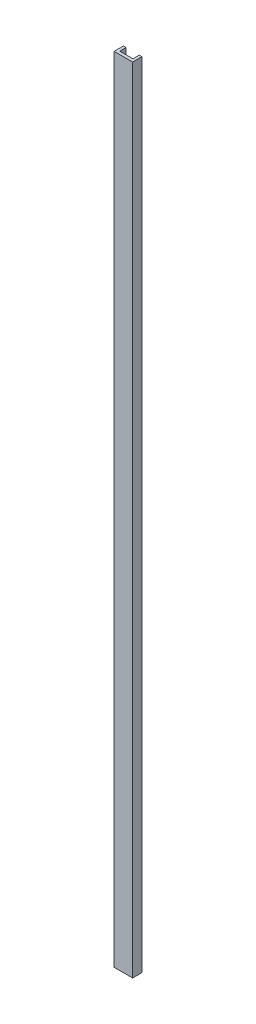
ISO-10303-21;
HEADER;
FILE_DESCRIPTION(('STEP AP214'),'2;1');
FILE_NAME('part.step','',(''),(''),'','','');
FILE_SCHEMA(('AUTOMOTIVE_DESIGN { 1 0 10303 214 1 1 1 1 }'));
ENDSEC;
DATA;
#1=APPLICATION_CONTEXT('core data for automotive mechanical design processes');
#2=APPLICATION_PROTOCOL_DEFINITION('international standard','automotive_design',2000,#1);
#3=PRODUCT_CONTEXT('',#1,'mechanical');
#4=PRODUCT('Part','Part','',(#3));
#5=PRODUCT_RELATED_PRODUCT_CATEGORY('part','',(#4));
#6=PRODUCT_DEFINITION_FORMATION('','',#4);
#7=PRODUCT_DEFINITION_CONTEXT('part definition',#1,'design');
#8=PRODUCT_DEFINITION('design','',#6,#7);
#9=PRODUCT_DEFINITION_SHAPE('','',#8);
#10=(LENGTH_UNIT() NAMED_UNIT(*) SI_UNIT(.MILLI.,.METRE.));
#11=(NAMED_UNIT(*) PLANE_ANGLE_UNIT() SI_UNIT($,.RADIAN.));
#12=(NAMED_UNIT(*) SI_UNIT($,.STERADIAN.) SOLID_ANGLE_UNIT());
#13=UNCERTAINTY_MEASURE_WITH_UNIT(LENGTH_MEASURE(1.E-05),#10,'distance_accuracy_value','');
#14=(GEOMETRIC_REPRESENTATION_CONTEXT(3) GLOBAL_UNCERTAINTY_ASSIGNED_CONTEXT((#13)) GLOBAL_UNIT_ASSIGNED_CONTEXT((#10,
#11,#12)) REPRESENTATION_CONTEXT('',''));
#15=CARTESIAN_POINT('',(0.,0.,0.));
#16=DIRECTION('',(0.,0.,1.));
#17=DIRECTION('',(1.,0.,0.));
#18=AXIS2_PLACEMENT_3D('',#15,#16,#17);
#19=CARTESIAN_POINT('',(-10.,1200.,-7.));
#20=DIRECTION('',(0.,0.,1.));
#21=DIRECTION('',(1.,0.,0.));
#22=AXIS2_PLACEMENT_3D('',#19,#20,#21);
#23=PLANE('',#22);
#24=DIRECTION('',(-1.,0.,0.));
#25=VECTOR('',#24,1.);
#26=CARTESIAN_POINT('',(-10.,0.,-7.));
#27=LINE('',#26,#25);
#28=CARTESIAN_POINT('',(-10.,0.,-7.));
#29=VERTEX_POINT('',#28);
#30=CARTESIAN_POINT('',(-14.,0.,-7.));
#31=VERTEX_POINT('',#30);
#32=EDGE_CURVE('E144',#29,#31,#27,.T.);
#33=ORIENTED_EDGE('',*,*,#32,.T.);
#34=DIRECTION('',(0.,-1.,0.));
#35=VECTOR('',#34,1.);
#36=CARTESIAN_POINT('',(-14.,1200.,-7.));
#37=LINE('',#36,#35);
#38=CARTESIAN_POINT('',(-14.,1200.,-7.));
#39=VERTEX_POINT('',#38);
#40=EDGE_CURVE('E11',#39,#31,#37,.T.);
#41=ORIENTED_EDGE('',*,*,#40,.F.);
#42=DIRECTION('',(-1.,0.,0.));
#43=VECTOR('',#42,1.);
#44=CARTESIAN_POINT('',(-10.,1200.,-7.));
#45=LINE('',#44,#43);
#46=CARTESIAN_POINT('',(-10.,1200.,-7.));
#47=VERTEX_POINT('',#46);
#48=EDGE_CURVE('E166',#47,#39,#45,.T.);
#49=ORIENTED_EDGE('',*,*,#48,.F.);
#50=DIRECTION('',(0.,-1.,0.));
#51=VECTOR('',#50,1.);
#52=CARTESIAN_POINT('',(-10.,1200.,-7.));
#53=LINE('',#52,#51);
#54=EDGE_CURVE('E140',#47,#29,#53,.T.);
#55=ORIENTED_EDGE('',*,*,#54,.T.);
#56=EDGE_LOOP('',(#33,#41,#49,#55));
#57=FACE_BOUND('',#56,.T.);
#58=ADVANCED_FACE('F43',(#57),#23,.F.);
#59=CARTESIAN_POINT('',(-14.,1200.,7.));
#60=DIRECTION('',(1.,0.,0.));
#61=DIRECTION('',(0.,0.,-1.));
#62=AXIS2_PLACEMENT_3D('',#59,#60,#61);
#63=PLANE('',#62);
#64=DIRECTION('',(0.,0.,1.));
#65=VECTOR('',#64,1.);
#66=CARTESIAN_POINT('',(-14.,0.,7.));
#67=LINE('',#66,#65);
#68=CARTESIAN_POINT('',(-14.,0.,7.));
#69=VERTEX_POINT('',#68);
#70=EDGE_CURVE('E148',#31,#69,#67,.T.);
#71=ORIENTED_EDGE('',*,*,#70,.T.);
#72=DIRECTION('',(0.,-1.,0.));
#73=VECTOR('',#72,1.);
#74=CARTESIAN_POINT('',(-14.,1200.,7.));
#75=LINE('',#74,#73);
#76=CARTESIAN_POINT('',(-14.,1200.,7.));
#77=VERTEX_POINT('',#76);
#78=EDGE_CURVE('E52',#77,#69,#75,.T.);
#79=ORIENTED_EDGE('',*,*,#78,.F.);
#80=DIRECTION('',(0.,0.,1.));
#81=VECTOR('',#80,1.);
#82=CARTESIAN_POINT('',(-14.,1200.,7.));
#83=LINE('',#82,#81);
#84=EDGE_CURVE('E103',#39,#77,#83,.T.);
#85=ORIENTED_EDGE('',*,*,#84,.F.);
#86=ORIENTED_EDGE('',*,*,#40,.T.);
#87=EDGE_LOOP('',(#71,#79,#85,#86));
#88=FACE_BOUND('',#87,.T.);
#89=ADVANCED_FACE('F212',(#88),#63,.F.);
#90=CARTESIAN_POINT('',(14.,1200.,7.));
#91=DIRECTION('',(0.,0.,-1.));
#92=DIRECTION('',(-1.,0.,0.));
#93=AXIS2_PLACEMENT_3D('',#90,#91,#92);
#94=PLANE('',#93);
#95=DIRECTION('',(1.,0.,0.));
#96=VECTOR('',#95,1.);
#97=CARTESIAN_POINT('',(14.,0.,7.));
#98=LINE('',#97,#96);
#99=CARTESIAN_POINT('',(14.,0.,7.));
#100=VERTEX_POINT('',#99);
#101=EDGE_CURVE('E151',#69,#100,#98,.T.);
#102=ORIENTED_EDGE('',*,*,#101,.T.);
#103=DIRECTION('',(0.,-1.,0.));
#104=VECTOR('',#103,1.);
#105=CARTESIAN_POINT('',(14.,1200.,7.));
#106=LINE('',#105,#104);
#107=CARTESIAN_POINT('',(14.,1200.,7.));
#108=VERTEX_POINT('',#107);
#109=EDGE_CURVE('E177',#108,#100,#106,.T.);
#110=ORIENTED_EDGE('',*,*,#109,.F.);
#111=DIRECTION('',(1.,0.,0.));
#112=VECTOR('',#111,1.);
#113=CARTESIAN_POINT('',(14.,1200.,7.));
#114=LINE('',#113,#112);
#115=EDGE_CURVE('E187',#77,#108,#114,.T.);
#116=ORIENTED_EDGE('',*,*,#115,.F.);
#117=ORIENTED_EDGE('',*,*,#78,.T.);
#118=EDGE_LOOP('',(#102,#110,#116,#117));
#119=FACE_BOUND('',#118,.T.);
#120=ADVANCED_FACE('F185',(#119),#94,.F.);
#121=CARTESIAN_POINT('',(14.,1200.,7.));
#122=DIRECTION('',(-1.,0.,0.));
#123=DIRECTION('',(0.,0.,1.));
#124=AXIS2_PLACEMENT_3D('',#121,#122,#123);
#125=PLANE('',#124);
#126=DIRECTION('',(0.,0.,-1.));
#127=VECTOR('',#126,1.);
#128=CARTESIAN_POINT('',(14.,0.,7.));
#129=LINE('',#128,#127);
#130=CARTESIAN_POINT('',(14.,0.,-7.));
#131=VERTEX_POINT('',#130);
#132=EDGE_CURVE('E154',#100,#131,#129,.T.);
#133=ORIENTED_EDGE('',*,*,#132,.T.);
#134=DIRECTION('',(0.,-1.,0.));
#135=VECTOR('',#134,1.);
#136=CARTESIAN_POINT('',(14.,1200.,-7.));
#137=LINE('',#136,#135);
#138=CARTESIAN_POINT('',(14.,1200.,-7.));
#139=VERTEX_POINT('',#138);
#140=EDGE_CURVE('E173',#139,#131,#137,.T.);
#141=ORIENTED_EDGE('',*,*,#140,.F.);
#142=DIRECTION('',(0.,0.,-1.));
#143=VECTOR('',#142,1.);
#144=CARTESIAN_POINT('',(14.,1200.,7.));
#145=LINE('',#144,#143);
#146=EDGE_CURVE('E200',#108,#139,#145,.T.);
#147=ORIENTED_EDGE('',*,*,#146,.F.);
#148=ORIENTED_EDGE('',*,*,#109,.T.);
#149=EDGE_LOOP('',(#133,#141,#147,#148));
#150=FACE_BOUND('',#149,.T.);
#151=ADVANCED_FACE('F195',(#150),#125,.F.);
#152=CARTESIAN_POINT('',(14.,1200.,-7.));
#153=DIRECTION('',(0.,0.,1.));
#154=DIRECTION('',(1.,0.,0.));
#155=AXIS2_PLACEMENT_3D('',#152,#153,#154);
#156=PLANE('',#155);
#157=DIRECTION('',(-1.,0.,0.));
#158=VECTOR('',#157,1.);
#159=CARTESIAN_POINT('',(14.,0.,-7.));
#160=LINE('',#159,#158);
#161=CARTESIAN_POINT('',(10.,0.,-7.));
#162=VERTEX_POINT('',#161);
#163=EDGE_CURVE('E157',#131,#162,#160,.T.);
#164=ORIENTED_EDGE('',*,*,#163,.T.);
#165=DIRECTION('',(0.,-1.,0.));
#166=VECTOR('',#165,1.);
#167=CARTESIAN_POINT('',(10.,1200.,-7.));
#168=LINE('',#167,#166);
#169=CARTESIAN_POINT('',(10.,1200.,-7.));
#170=VERTEX_POINT('',#169);
#171=EDGE_CURVE('E133',#170,#162,#168,.T.);
#172=ORIENTED_EDGE('',*,*,#171,.F.);
#173=DIRECTION('',(-1.,0.,0.));
#174=VECTOR('',#173,1.);
#175=CARTESIAN_POINT('',(14.,1200.,-7.));
#176=LINE('',#175,#174);
#177=EDGE_CURVE('E122',#139,#170,#176,.T.);
#178=ORIENTED_EDGE('',*,*,#177,.F.);
#179=ORIENTED_EDGE('',*,*,#140,.T.);
#180=EDGE_LOOP('',(#164,#172,#178,#179));
#181=FACE_BOUND('',#180,.T.);
#182=ADVANCED_FACE('F198',(#181),#156,.F.);
#183=CARTESIAN_POINT('',(10.,1200.,2.5));
#184=DIRECTION('',(1.,0.,0.));
#185=DIRECTION('',(0.,0.,-1.));
#186=AXIS2_PLACEMENT_3D('',#183,#184,#185);
#187=PLANE('',#186);
#188=DIRECTION('',(0.,0.,1.));
#189=VECTOR('',#188,1.);
#190=CARTESIAN_POINT('',(10.,0.,2.5));
#191=LINE('',#190,#189);
#192=CARTESIAN_POINT('',(10.,0.,2.5));
#193=VERTEX_POINT('',#192);
#194=EDGE_CURVE('E131',#162,#193,#191,.T.);
#195=ORIENTED_EDGE('',*,*,#194,.T.);
#196=DIRECTION('',(0.,-1.,0.));
#197=VECTOR('',#196,1.);
#198=CARTESIAN_POINT('',(10.,1200.,2.5));
#199=LINE('',#198,#197);
#200=CARTESIAN_POINT('',(10.,1200.,2.5));
#201=VERTEX_POINT('',#200);
#202=EDGE_CURVE('E128',#201,#193,#199,.T.);
#203=ORIENTED_EDGE('',*,*,#202,.F.);
#204=DIRECTION('',(0.,0.,1.));
#205=VECTOR('',#204,1.);
#206=CARTESIAN_POINT('',(10.,1200.,2.5));
#207=LINE('',#206,#205);
#208=EDGE_CURVE('E116',#170,#201,#207,.T.);
#209=ORIENTED_EDGE('',*,*,#208,.F.);
#210=ORIENTED_EDGE('',*,*,#171,.T.);
#211=EDGE_LOOP('',(#195,#203,#209,#210));
#212=FACE_BOUND('',#211,.T.);
#213=ADVANCED_FACE('F129',(#212),#187,.F.);
#214=CARTESIAN_POINT('',(-9.99999999999999,1200.,2.5));
#215=DIRECTION('',(0.,0.,1.));
#216=DIRECTION('',(1.,0.,0.));
#217=AXIS2_PLACEMENT_3D('',#214,#215,#216);
#218=PLANE('',#217);
#219=DIRECTION('',(-1.,0.,0.));
#220=VECTOR('',#219,1.);
#221=CARTESIAN_POINT('',(-9.99999999999999,0.,2.5));
#222=LINE('',#221,#220);
#223=CARTESIAN_POINT('',(-9.99999999999999,0.,2.5));
#224=VERTEX_POINT('',#223);
#225=EDGE_CURVE('E89',#193,#224,#222,.T.);
#226=ORIENTED_EDGE('',*,*,#225,.T.);
#227=DIRECTION('',(0.,-1.,0.));
#228=VECTOR('',#227,1.);
#229=CARTESIAN_POINT('',(-9.99999999999999,1200.,2.5));
#230=LINE('',#229,#228);
#231=CARTESIAN_POINT('',(-9.99999999999999,1200.,2.5));
#232=VERTEX_POINT('',#231);
#233=EDGE_CURVE('E134',#232,#224,#230,.T.);
#234=ORIENTED_EDGE('',*,*,#233,.F.);
#235=DIRECTION('',(-1.,0.,0.));
#236=VECTOR('',#235,1.);
#237=CARTESIAN_POINT('',(-9.99999999999999,1200.,2.5));
#238=LINE('',#237,#236);
#239=EDGE_CURVE('E120',#201,#232,#238,.T.);
#240=ORIENTED_EDGE('',*,*,#239,.F.);
#241=ORIENTED_EDGE('',*,*,#202,.T.);
#242=EDGE_LOOP('',(#226,#234,#240,#241));
#243=FACE_BOUND('',#242,.T.);
#244=ADVANCED_FACE('F136',(#243),#218,.F.);
#245=CARTESIAN_POINT('',(-10.,1200.,-7.));
#246=DIRECTION('',(-1.,0.,0.));
#247=DIRECTION('',(0.,0.,1.));
#248=AXIS2_PLACEMENT_3D('',#245,#246,#247);
#249=PLANE('',#248);
#250=DIRECTION('',(0.,0.,-1.));
#251=VECTOR('',#250,1.);
#252=CARTESIAN_POINT('',(-10.,0.,-7.));
#253=LINE('',#252,#251);
#254=EDGE_CURVE('E95',#224,#29,#253,.T.);
#255=ORIENTED_EDGE('',*,*,#254,.T.);
#256=ORIENTED_EDGE('',*,*,#54,.F.);
#257=DIRECTION('',(0.,0.,-1.));
#258=VECTOR('',#257,1.);
#259=CARTESIAN_POINT('',(-10.,1200.,-7.));
#260=LINE('',#259,#258);
#261=EDGE_CURVE('E60',#232,#47,#260,.T.);
#262=ORIENTED_EDGE('',*,*,#261,.F.);
#263=ORIENTED_EDGE('',*,*,#233,.T.);
#264=EDGE_LOOP('',(#255,#256,#262,#263));
#265=FACE_BOUND('',#264,.T.);
#266=ADVANCED_FACE('F228',(#265),#249,.F.);
#267=CARTESIAN_POINT('',(0.,1200.,0.));
#268=DIRECTION('',(0.,-1.,0.));
#269=DIRECTION('',(0.,0.,-1.));
#270=AXIS2_PLACEMENT_3D('',#267,#268,#269);
#271=PLANE('',#270);
#272=ORIENTED_EDGE('',*,*,#48,.T.);
#273=ORIENTED_EDGE('',*,*,#84,.T.);
#274=ORIENTED_EDGE('',*,*,#115,.T.);
#275=ORIENTED_EDGE('',*,*,#146,.T.);
#276=ORIENTED_EDGE('',*,*,#177,.T.);
#277=ORIENTED_EDGE('',*,*,#208,.T.);
#278=ORIENTED_EDGE('',*,*,#239,.T.);
#279=ORIENTED_EDGE('',*,*,#261,.T.);
#280=EDGE_LOOP('',(#272,#273,#274,#275,#276,#277,#278,#279));
#281=FACE_BOUND('',#280,.T.);
#282=ADVANCED_FACE('F118',(#281),#271,.F.);
#283=CARTESIAN_POINT('',(0.,0.,0.));
#284=DIRECTION('',(0.,-1.,0.));
#285=DIRECTION('',(0.,0.,-1.));
#286=AXIS2_PLACEMENT_3D('',#283,#284,#285);
#287=PLANE('',#286);
#288=ORIENTED_EDGE('',*,*,#32,.F.);
#289=ORIENTED_EDGE('',*,*,#254,.F.);
#290=ORIENTED_EDGE('',*,*,#225,.F.);
#291=ORIENTED_EDGE('',*,*,#194,.F.);
#292=ORIENTED_EDGE('',*,*,#163,.F.);
#293=ORIENTED_EDGE('',*,*,#132,.F.);
#294=ORIENTED_EDGE('',*,*,#101,.F.);
#295=ORIENTED_EDGE('',*,*,#70,.F.);
#296=EDGE_LOOP('',(#288,#289,#290,#291,#292,#293,#294,#295));
#297=FACE_BOUND('',#296,.T.);
#298=ADVANCED_FACE('F191',(#297),#287,.T.);
#299=CLOSED_SHELL('',(#58,#89,#120,#151,#182,#213,#244,#266,#282,#298));
#300=MANIFOLD_SOLID_BREP('B2',#299);
#301=ADVANCED_BREP_SHAPE_REPRESENTATION('',(#18,#300),#14);
#302=SHAPE_DEFINITION_REPRESENTATION(#9,#301);
ENDSEC;
END-ISO-10303-21;
